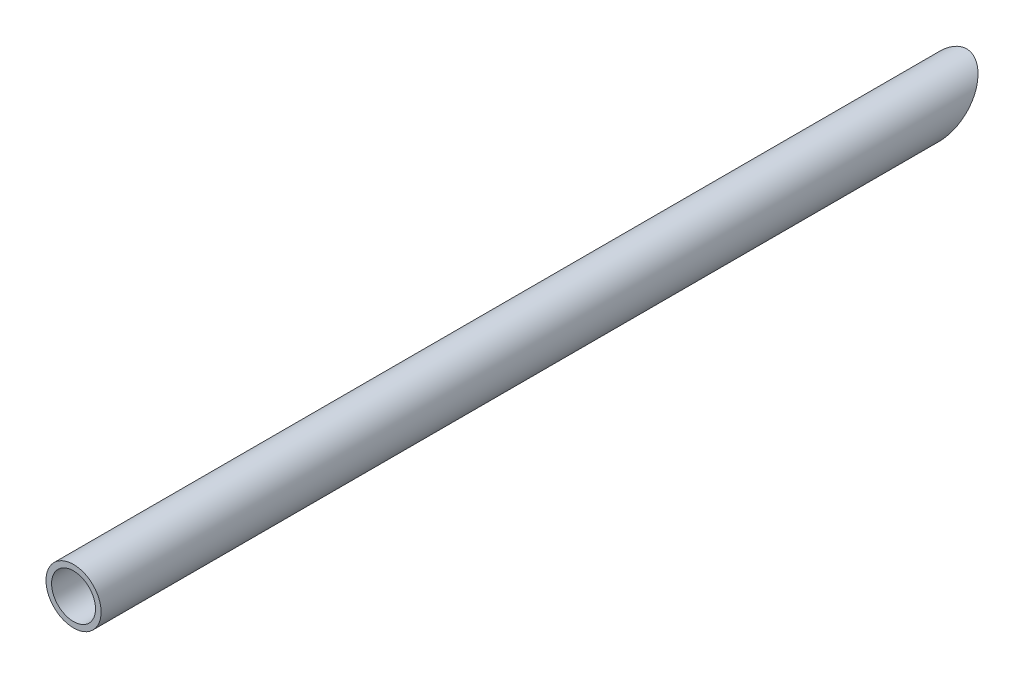
ISO-10303-21;
HEADER;
FILE_DESCRIPTION(('STEP AP214'),'2;1');
FILE_NAME('part.step','',(''),(''),'','','');
FILE_SCHEMA(('AUTOMOTIVE_DESIGN { 1 0 10303 214 1 1 1 1 }'));
ENDSEC;
DATA;
#1=APPLICATION_CONTEXT('core data for automotive mechanical design processes');
#2=APPLICATION_PROTOCOL_DEFINITION('international standard','automotive_design',2000,#1);
#3=PRODUCT_CONTEXT('',#1,'mechanical');
#4=PRODUCT('Part','Part','',(#3));
#5=PRODUCT_RELATED_PRODUCT_CATEGORY('part','',(#4));
#6=PRODUCT_DEFINITION_FORMATION('','',#4);
#7=PRODUCT_DEFINITION_CONTEXT('part definition',#1,'design');
#8=PRODUCT_DEFINITION('design','',#6,#7);
#9=PRODUCT_DEFINITION_SHAPE('','',#8);
#10=(LENGTH_UNIT() NAMED_UNIT(*) SI_UNIT(.MILLI.,.METRE.));
#11=(NAMED_UNIT(*) PLANE_ANGLE_UNIT() SI_UNIT($,.RADIAN.));
#12=(NAMED_UNIT(*) SI_UNIT($,.STERADIAN.) SOLID_ANGLE_UNIT());
#13=UNCERTAINTY_MEASURE_WITH_UNIT(LENGTH_MEASURE(1.E-05),#10,'distance_accuracy_value','');
#14=(GEOMETRIC_REPRESENTATION_CONTEXT(3) GLOBAL_UNCERTAINTY_ASSIGNED_CONTEXT((#13)) GLOBAL_UNIT_ASSIGNED_CONTEXT((#10,
#11,#12)) REPRESENTATION_CONTEXT('',''));
#15=CARTESIAN_POINT('',(0.,0.,0.));
#16=DIRECTION('',(0.,0.,1.));
#17=DIRECTION('',(1.,0.,0.));
#18=AXIS2_PLACEMENT_3D('',#15,#16,#17);
#19=CARTESIAN_POINT('',(0.,-8.35025005,-8.35025004999997));
#20=DIRECTION('',(0.,0.707106781186548,0.707106781186547));
#21=DIRECTION('',(0.,-0.707106781186547,0.707106781186548));
#22=AXIS2_PLACEMENT_3D('',#19,#20,#21);
#23=PLANE('',#22);
#24=CARTESIAN_POINT('',(0.,0.,-16.7005001));
#25=DIRECTION('',(0.,0.707106781186548,0.707106781186547));
#26=DIRECTION('',(0.,-0.707106781186547,0.707106781186548));
#27=AXIS2_PLACEMENT_3D('',#24,#25,#26);
#28=ELLIPSE('',#27,23.6180735984119,16.7005);
#29=CARTESIAN_POINT('',(0.,-16.7005,-9.99999492934389E-08));
#30=VERTEX_POINT('',#29);
#31=EDGE_CURVE('E27',#30,#30,#28,.T.);
#32=ORIENTED_EDGE('',*,*,#31,.F.);
#33=EDGE_LOOP('',(#32));
#34=FACE_BOUND('',#33,.T.);
#35=CARTESIAN_POINT('',(0.,0.,-16.7005001));
#36=DIRECTION('',(0.,-0.707106781186548,-0.707106781186547));
#37=DIRECTION('',(0.,-0.707106781186547,0.707106781186548));
#38=AXIS2_PLACEMENT_3D('',#35,#36,#37);
#39=ELLIPSE('',#38,18.8405773420031,13.3223);
#40=CARTESIAN_POINT('',(0.,-13.3223,-3.37820009999996));
#41=VERTEX_POINT('',#40);
#42=EDGE_CURVE('E9',#41,#41,#39,.T.);
#43=ORIENTED_EDGE('',*,*,#42,.F.);
#44=EDGE_LOOP('',(#43));
#45=FACE_BOUND('',#44,.T.);
#46=ADVANCED_FACE('F14',(#34,#45),#23,.F.);
#47=CARTESIAN_POINT('',(0.,0.,0.));
#48=DIRECTION('',(0.,0.,1.));
#49=DIRECTION('',(1.,0.,0.));
#50=AXIS2_PLACEMENT_3D('',#47,#48,#49);
#51=CYLINDRICAL_SURFACE('',#50,13.3223);
#52=ORIENTED_EDGE('',*,*,#42,.T.);
#53=EDGE_LOOP('',(#52));
#54=FACE_BOUND('',#53,.T.);
#55=CARTESIAN_POINT('',(0.,0.,508.));
#56=DIRECTION('',(0.,0.,1.));
#57=DIRECTION('',(1.,0.,0.));
#58=AXIS2_PLACEMENT_3D('',#55,#56,#57);
#59=CIRCLE('',#58,13.3223);
#60=CARTESIAN_POINT('',(13.3223,0.,508.));
#61=VERTEX_POINT('',#60);
#62=EDGE_CURVE('E22',#61,#61,#59,.T.);
#63=ORIENTED_EDGE('',*,*,#62,.T.);
#64=EDGE_LOOP('',(#63));
#65=FACE_BOUND('',#64,.T.);
#66=ADVANCED_FACE('F42',(#54,#65),#51,.F.);
#67=CARTESIAN_POINT('',(0.,0.,0.));
#68=DIRECTION('',(0.,0.,1.));
#69=DIRECTION('',(1.,0.,0.));
#70=AXIS2_PLACEMENT_3D('',#67,#68,#69);
#71=CYLINDRICAL_SURFACE('',#70,16.7005);
#72=ORIENTED_EDGE('',*,*,#31,.T.);
#73=EDGE_LOOP('',(#72));
#74=FACE_BOUND('',#73,.T.);
#75=CARTESIAN_POINT('',(0.,0.,508.));
#76=DIRECTION('',(0.,0.,-1.));
#77=DIRECTION('',(0.,-1.,0.));
#78=AXIS2_PLACEMENT_3D('',#75,#76,#77);
#79=CIRCLE('',#78,16.7005);
#80=CARTESIAN_POINT('',(0.,-16.7005,508.));
#81=VERTEX_POINT('',#80);
#82=EDGE_CURVE('E18',#81,#81,#79,.T.);
#83=ORIENTED_EDGE('',*,*,#82,.T.);
#84=EDGE_LOOP('',(#83));
#85=FACE_BOUND('',#84,.T.);
#86=ADVANCED_FACE('F16',(#74,#85),#71,.T.);
#87=CARTESIAN_POINT('',(0.,0.,508.));
#88=DIRECTION('',(0.,0.,1.));
#89=DIRECTION('',(1.,0.,0.));
#90=AXIS2_PLACEMENT_3D('',#87,#88,#89);
#91=PLANE('',#90);
#92=ORIENTED_EDGE('',*,*,#82,.F.);
#93=EDGE_LOOP('',(#92));
#94=FACE_BOUND('',#93,.T.);
#95=ORIENTED_EDGE('',*,*,#62,.F.);
#96=EDGE_LOOP('',(#95));
#97=FACE_BOUND('',#96,.T.);
#98=ADVANCED_FACE('F36',(#94,#97),#91,.T.);
#99=CLOSED_SHELL('',(#46,#66,#86,#98));
#100=MANIFOLD_SOLID_BREP('B1',#99);
#101=ADVANCED_BREP_SHAPE_REPRESENTATION('',(#18,#100),#14);
#102=SHAPE_DEFINITION_REPRESENTATION(#9,#101);
ENDSEC;
END-ISO-10303-21;
